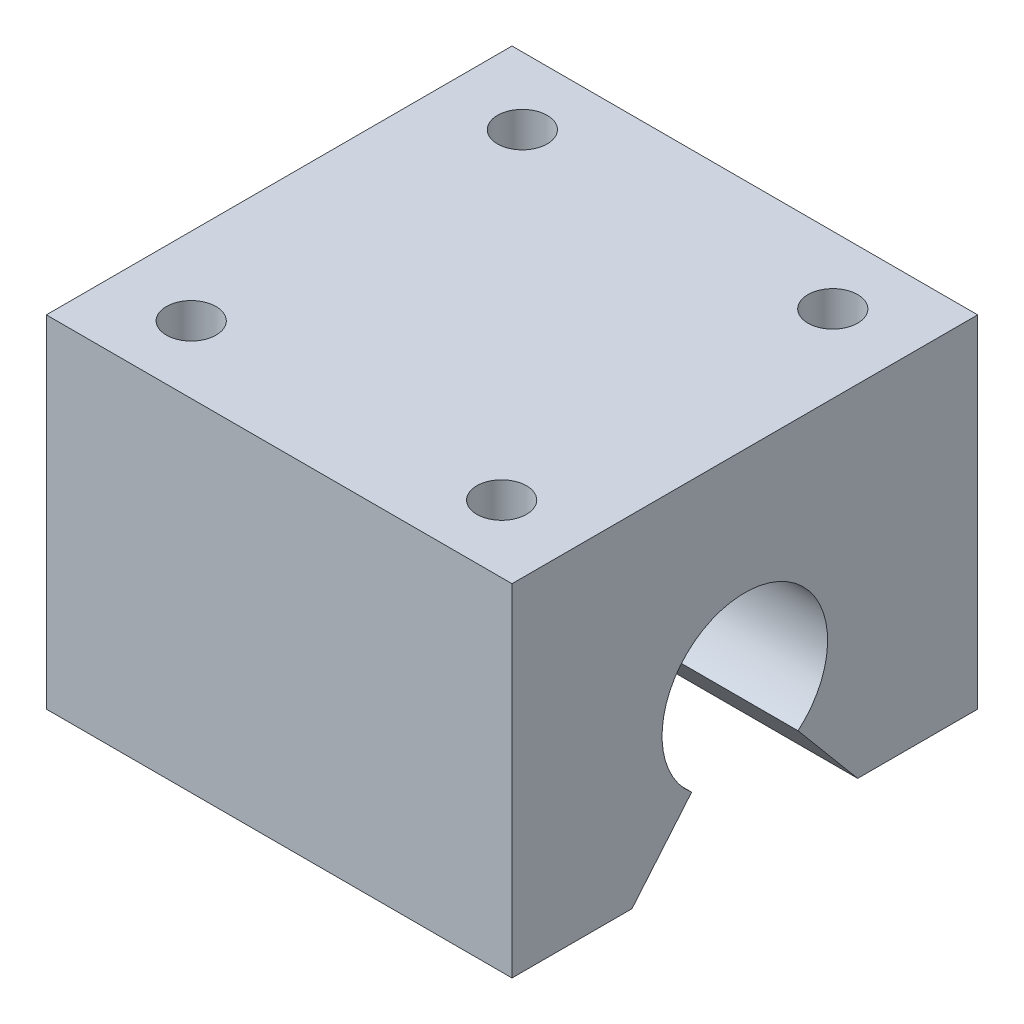
ISO-10303-21;
HEADER;
FILE_DESCRIPTION(('STEP AP214'),'2;1');
FILE_NAME('part.step','',(''),(''),'','','');
FILE_SCHEMA(('AUTOMOTIVE_DESIGN { 1 0 10303 214 1 1 1 1 }'));
ENDSEC;
DATA;
#1=APPLICATION_CONTEXT('core data for automotive mechanical design processes');
#2=APPLICATION_PROTOCOL_DEFINITION('international standard','automotive_design',2000,#1);
#3=PRODUCT_CONTEXT('',#1,'mechanical');
#4=PRODUCT('Part','Part','',(#3));
#5=PRODUCT_RELATED_PRODUCT_CATEGORY('part','',(#4));
#6=PRODUCT_DEFINITION_FORMATION('','',#4);
#7=PRODUCT_DEFINITION_CONTEXT('part definition',#1,'design');
#8=PRODUCT_DEFINITION('design','',#6,#7);
#9=PRODUCT_DEFINITION_SHAPE('','',#8);
#10=(LENGTH_UNIT() NAMED_UNIT(*) SI_UNIT(.MILLI.,.METRE.));
#11=(NAMED_UNIT(*) PLANE_ANGLE_UNIT() SI_UNIT($,.RADIAN.));
#12=(NAMED_UNIT(*) SI_UNIT($,.STERADIAN.) SOLID_ANGLE_UNIT());
#13=UNCERTAINTY_MEASURE_WITH_UNIT(LENGTH_MEASURE(1.E-05),#10,'distance_accuracy_value','');
#14=(GEOMETRIC_REPRESENTATION_CONTEXT(3) GLOBAL_UNCERTAINTY_ASSIGNED_CONTEXT((#13)) GLOBAL_UNIT_ASSIGNED_CONTEXT((#10,
#11,#12)) REPRESENTATION_CONTEXT('',''));
#15=CARTESIAN_POINT('',(0.,0.,0.));
#16=DIRECTION('',(0.,0.,1.));
#17=DIRECTION('',(1.,0.,0.));
#18=AXIS2_PLACEMENT_3D('',#15,#16,#17);
#19=CARTESIAN_POINT('',(45.,0.,0.));
#20=DIRECTION('',(-1.,0.,0.));
#21=DIRECTION('',(0.,0.,1.));
#22=AXIS2_PLACEMENT_3D('',#19,#20,#21);
#23=CYLINDRICAL_SURFACE('',#22,8.);
#24=CARTESIAN_POINT('',(0.,0.,0.));
#25=DIRECTION('',(-1.,0.,0.));
#26=DIRECTION('',(0.,0.,-1.));
#27=AXIS2_PLACEMENT_3D('',#24,#25,#26);
#28=CIRCLE('',#27,8.);
#29=CARTESIAN_POINT('',(0.,-6.12835554495185,5.14230087749228));
#30=VERTEX_POINT('',#29);
#31=CARTESIAN_POINT('',(0.,-6.12835554495185,-5.14230087749228));
#32=VERTEX_POINT('',#31);
#33=EDGE_CURVE('E130',#30,#32,#28,.T.);
#34=ORIENTED_EDGE('',*,*,#33,.T.);
#35=DIRECTION('',(-1.,0.,0.));
#36=VECTOR('',#35,1.);
#37=CARTESIAN_POINT('',(45.,-6.12835554495185,-5.14230087749228));
#38=LINE('',#37,#36);
#39=CARTESIAN_POINT('',(45.,-6.12835554495185,-5.14230087749228));
#40=VERTEX_POINT('',#39);
#41=EDGE_CURVE('E11',#40,#32,#38,.T.);
#42=ORIENTED_EDGE('',*,*,#41,.F.);
#43=CARTESIAN_POINT('',(45.,0.,0.));
#44=DIRECTION('',(-1.,0.,0.));
#45=DIRECTION('',(0.,0.,-1.));
#46=AXIS2_PLACEMENT_3D('',#43,#44,#45);
#47=CIRCLE('',#46,8.);
#48=CARTESIAN_POINT('',(45.,-6.12835554495185,5.14230087749228));
#49=VERTEX_POINT('',#48);
#50=EDGE_CURVE('E145',#49,#40,#47,.T.);
#51=ORIENTED_EDGE('',*,*,#50,.F.);
#52=DIRECTION('',(-1.,0.,0.));
#53=VECTOR('',#52,1.);
#54=CARTESIAN_POINT('',(45.,-6.12835554495185,5.14230087749228));
#55=LINE('',#54,#53);
#56=EDGE_CURVE('E126',#49,#30,#55,.T.);
#57=ORIENTED_EDGE('',*,*,#56,.T.);
#58=EDGE_LOOP('',(#34,#42,#51,#57));
#59=FACE_BOUND('',#58,.T.);
#60=ADVANCED_FACE('F34',(#59),#23,.F.);
#61=CARTESIAN_POINT('',(45.,-6.12835554495185,-5.14230087749228));
#62=DIRECTION('',(0.,0.642787609686535,-0.766044443118982));
#63=DIRECTION('',(0.,0.766044443118982,0.642787609686535));
#64=AXIS2_PLACEMENT_3D('',#61,#62,#63);
#65=PLANE('',#64);
#66=DIRECTION('',(0.,-0.766044443118982,-0.642787609686535));
#67=VECTOR('',#66,1.);
#68=CARTESIAN_POINT('',(0.,-6.12835554495185,-5.14230087749228));
#69=LINE('',#68,#67);
#70=CARTESIAN_POINT('',(0.,-13.,-10.9082952053045));
#71=VERTEX_POINT('',#70);
#72=EDGE_CURVE('E133',#32,#71,#69,.T.);
#73=ORIENTED_EDGE('',*,*,#72,.T.);
#74=DIRECTION('',(-1.,0.,0.));
#75=VECTOR('',#74,1.);
#76=CARTESIAN_POINT('',(45.,-13.,-10.9082952053045));
#77=LINE('',#76,#75);
#78=CARTESIAN_POINT('',(45.,-13.,-10.9082952053045));
#79=VERTEX_POINT('',#78);
#80=EDGE_CURVE('E42',#79,#71,#77,.T.);
#81=ORIENTED_EDGE('',*,*,#80,.F.);
#82=DIRECTION('',(0.,-0.766044443118982,-0.642787609686535));
#83=VECTOR('',#82,1.);
#84=CARTESIAN_POINT('',(45.,-6.12835554495185,-5.14230087749228));
#85=LINE('',#84,#83);
#86=EDGE_CURVE('E93',#40,#79,#85,.T.);
#87=ORIENTED_EDGE('',*,*,#86,.F.);
#88=ORIENTED_EDGE('',*,*,#41,.T.);
#89=EDGE_LOOP('',(#73,#81,#87,#88));
#90=FACE_BOUND('',#89,.T.);
#91=ADVANCED_FACE('F236',(#90),#65,.F.);
#92=CARTESIAN_POINT('',(45.,-13.,-10.9082952053045));
#93=DIRECTION('',(0.,1.,0.));
#94=DIRECTION('',(0.,0.,1.));
#95=AXIS2_PLACEMENT_3D('',#92,#93,#94);
#96=PLANE('',#95);
#97=DIRECTION('',(0.,0.,-1.));
#98=VECTOR('',#97,1.);
#99=CARTESIAN_POINT('',(0.,-13.,-10.9082952053045));
#100=LINE('',#99,#98);
#101=CARTESIAN_POINT('',(0.,-13.,-22.5));
#102=VERTEX_POINT('',#101);
#103=EDGE_CURVE('E136',#71,#102,#100,.T.);
#104=ORIENTED_EDGE('',*,*,#103,.T.);
#105=DIRECTION('',(-1.,0.,0.));
#106=VECTOR('',#105,1.);
#107=CARTESIAN_POINT('',(45.,-13.,-22.5));
#108=LINE('',#107,#106);
#109=CARTESIAN_POINT('',(45.,-13.,-22.5));
#110=VERTEX_POINT('',#109);
#111=EDGE_CURVE('E152',#110,#102,#108,.T.);
#112=ORIENTED_EDGE('',*,*,#111,.F.);
#113=DIRECTION('',(0.,0.,-1.));
#114=VECTOR('',#113,1.);
#115=CARTESIAN_POINT('',(45.,-13.,-10.9082952053045));
#116=LINE('',#115,#114);
#117=EDGE_CURVE('E160',#79,#110,#116,.T.);
#118=ORIENTED_EDGE('',*,*,#117,.F.);
#119=ORIENTED_EDGE('',*,*,#80,.T.);
#120=EDGE_LOOP('',(#104,#112,#118,#119));
#121=FACE_BOUND('',#120,.T.);
#122=ADVANCED_FACE('F158',(#121),#96,.F.);
#123=CARTESIAN_POINT('',(45.,20.,-22.5));
#124=DIRECTION('',(0.,0.,1.));
#125=DIRECTION('',(0.,-1.,0.));
#126=AXIS2_PLACEMENT_3D('',#123,#124,#125);
#127=PLANE('',#126);
#128=DIRECTION('',(0.,1.,0.));
#129=VECTOR('',#128,1.);
#130=CARTESIAN_POINT('',(0.,20.,-22.5));
#131=LINE('',#130,#129);
#132=CARTESIAN_POINT('',(0.,20.,-22.5));
#133=VERTEX_POINT('',#132);
#134=EDGE_CURVE('E138',#102,#133,#131,.T.);
#135=ORIENTED_EDGE('',*,*,#134,.T.);
#136=DIRECTION('',(-1.,0.,0.));
#137=VECTOR('',#136,1.);
#138=CARTESIAN_POINT('',(45.,20.,-22.5));
#139=LINE('',#138,#137);
#140=CARTESIAN_POINT('',(45.,20.,-22.5));
#141=VERTEX_POINT('',#140);
#142=EDGE_CURVE('E149',#141,#133,#139,.T.);
#143=ORIENTED_EDGE('',*,*,#142,.F.);
#144=DIRECTION('',(0.,1.,0.));
#145=VECTOR('',#144,1.);
#146=CARTESIAN_POINT('',(45.,20.,-22.5));
#147=LINE('',#146,#145);
#148=EDGE_CURVE('E172',#110,#141,#147,.T.);
#149=ORIENTED_EDGE('',*,*,#148,.F.);
#150=ORIENTED_EDGE('',*,*,#111,.T.);
#151=EDGE_LOOP('',(#135,#143,#149,#150));
#152=FACE_BOUND('',#151,.T.);
#153=ADVANCED_FACE('F168',(#152),#127,.F.);
#154=CARTESIAN_POINT('',(45.,20.,22.5));
#155=DIRECTION('',(0.,-1.,0.));
#156=DIRECTION('',(0.,0.,-1.));
#157=AXIS2_PLACEMENT_3D('',#154,#155,#156);
#158=PLANE('',#157);
#159=CARTESIAN_POINT('',(7.5,20.,16.));
#160=DIRECTION('',(0.,1.,0.));
#161=DIRECTION('',(0.,0.,1.));
#162=AXIS2_PLACEMENT_3D('',#159,#160,#161);
#163=CIRCLE('',#162,2.4);
#164=CARTESIAN_POINT('',(7.5,20.,18.4));
#165=VERTEX_POINT('',#164);
#166=EDGE_CURVE('E196',#165,#165,#163,.T.);
#167=ORIENTED_EDGE('',*,*,#166,.F.);
#168=EDGE_LOOP('',(#167));
#169=FACE_BOUND('',#168,.T.);
#170=CARTESIAN_POINT('',(37.5,20.,16.));
#171=DIRECTION('',(0.,1.,0.));
#172=DIRECTION('',(0.,0.,1.));
#173=AXIS2_PLACEMENT_3D('',#170,#171,#172);
#174=CIRCLE('',#173,2.4);
#175=CARTESIAN_POINT('',(37.5,20.,18.4));
#176=VERTEX_POINT('',#175);
#177=EDGE_CURVE('E190',#176,#176,#174,.T.);
#178=ORIENTED_EDGE('',*,*,#177,.F.);
#179=EDGE_LOOP('',(#178));
#180=FACE_BOUND('',#179,.T.);
#181=CARTESIAN_POINT('',(37.5,20.,-16.));
#182=DIRECTION('',(0.,1.,0.));
#183=DIRECTION('',(0.,0.,1.));
#184=AXIS2_PLACEMENT_3D('',#181,#182,#183);
#185=CIRCLE('',#184,2.4);
#186=CARTESIAN_POINT('',(37.5,20.,-13.6));
#187=VERTEX_POINT('',#186);
#188=EDGE_CURVE('E184',#187,#187,#185,.T.);
#189=ORIENTED_EDGE('',*,*,#188,.F.);
#190=EDGE_LOOP('',(#189));
#191=FACE_BOUND('',#190,.T.);
#192=CARTESIAN_POINT('',(7.5,20.,-16.));
#193=DIRECTION('',(0.,1.,0.));
#194=DIRECTION('',(0.,0.,1.));
#195=AXIS2_PLACEMENT_3D('',#192,#193,#194);
#196=CIRCLE('',#195,2.4);
#197=CARTESIAN_POINT('',(7.5,20.,-13.6));
#198=VERTEX_POINT('',#197);
#199=EDGE_CURVE('E178',#198,#198,#196,.T.);
#200=ORIENTED_EDGE('',*,*,#199,.F.);
#201=EDGE_LOOP('',(#200));
#202=FACE_BOUND('',#201,.T.);
#203=DIRECTION('',(0.,0.,1.));
#204=VECTOR('',#203,1.);
#205=CARTESIAN_POINT('',(0.,20.,22.5));
#206=LINE('',#205,#204);
#207=CARTESIAN_POINT('',(0.,20.,22.5));
#208=VERTEX_POINT('',#207);
#209=EDGE_CURVE('E140',#133,#208,#206,.T.);
#210=ORIENTED_EDGE('',*,*,#209,.T.);
#211=DIRECTION('',(-1.,0.,0.));
#212=VECTOR('',#211,1.);
#213=CARTESIAN_POINT('',(45.,20.,22.5));
#214=LINE('',#213,#212);
#215=CARTESIAN_POINT('',(45.,20.,22.5));
#216=VERTEX_POINT('',#215);
#217=EDGE_CURVE('E121',#216,#208,#214,.T.);
#218=ORIENTED_EDGE('',*,*,#217,.F.);
#219=DIRECTION('',(0.,0.,1.));
#220=VECTOR('',#219,1.);
#221=CARTESIAN_POINT('',(45.,20.,22.5));
#222=LINE('',#221,#220);
#223=EDGE_CURVE('E112',#141,#216,#222,.T.);
#224=ORIENTED_EDGE('',*,*,#223,.F.);
#225=ORIENTED_EDGE('',*,*,#142,.T.);
#226=EDGE_LOOP('',(#210,#218,#224,#225));
#227=FACE_BOUND('',#226,.T.);
#228=ADVANCED_FACE('F171',(#169,#180,#191,#202,#227),#158,.F.);
#229=CARTESIAN_POINT('',(45.,20.,22.5));
#230=DIRECTION('',(0.,0.,-1.));
#231=DIRECTION('',(0.,1.,0.));
#232=AXIS2_PLACEMENT_3D('',#229,#230,#231);
#233=PLANE('',#232);
#234=DIRECTION('',(0.,-1.,0.));
#235=VECTOR('',#234,1.);
#236=CARTESIAN_POINT('',(0.,20.,22.5));
#237=LINE('',#236,#235);
#238=CARTESIAN_POINT('',(0.,-13.,22.5));
#239=VERTEX_POINT('',#238);
#240=EDGE_CURVE('E120',#208,#239,#237,.T.);
#241=ORIENTED_EDGE('',*,*,#240,.T.);
#242=DIRECTION('',(-1.,0.,0.));
#243=VECTOR('',#242,1.);
#244=CARTESIAN_POINT('',(45.,-13.,22.5));
#245=LINE('',#244,#243);
#246=CARTESIAN_POINT('',(45.,-13.,22.5));
#247=VERTEX_POINT('',#246);
#248=EDGE_CURVE('E117',#247,#239,#245,.T.);
#249=ORIENTED_EDGE('',*,*,#248,.F.);
#250=DIRECTION('',(0.,-1.,0.));
#251=VECTOR('',#250,1.);
#252=CARTESIAN_POINT('',(45.,20.,22.5));
#253=LINE('',#252,#251);
#254=EDGE_CURVE('E106',#216,#247,#253,.T.);
#255=ORIENTED_EDGE('',*,*,#254,.F.);
#256=ORIENTED_EDGE('',*,*,#217,.T.);
#257=EDGE_LOOP('',(#241,#249,#255,#256));
#258=FACE_BOUND('',#257,.T.);
#259=ADVANCED_FACE('F118',(#258),#233,.F.);
#260=CARTESIAN_POINT('',(45.,-13.,22.5));
#261=DIRECTION('',(0.,1.,0.));
#262=DIRECTION('',(0.,0.,1.));
#263=AXIS2_PLACEMENT_3D('',#260,#261,#262);
#264=PLANE('',#263);
#265=DIRECTION('',(0.,0.,-1.));
#266=VECTOR('',#265,1.);
#267=CARTESIAN_POINT('',(0.,-13.,22.5));
#268=LINE('',#267,#266);
#269=CARTESIAN_POINT('',(0.,-13.,10.9082952053045));
#270=VERTEX_POINT('',#269);
#271=EDGE_CURVE('E79',#239,#270,#268,.T.);
#272=ORIENTED_EDGE('',*,*,#271,.T.);
#273=DIRECTION('',(-1.,0.,0.));
#274=VECTOR('',#273,1.);
#275=CARTESIAN_POINT('',(45.,-13.,10.9082952053045));
#276=LINE('',#275,#274);
#277=CARTESIAN_POINT('',(45.,-13.,10.9082952053045));
#278=VERTEX_POINT('',#277);
#279=EDGE_CURVE('E122',#278,#270,#276,.T.);
#280=ORIENTED_EDGE('',*,*,#279,.F.);
#281=DIRECTION('',(0.,0.,-1.));
#282=VECTOR('',#281,1.);
#283=CARTESIAN_POINT('',(45.,-13.,22.5));
#284=LINE('',#283,#282);
#285=EDGE_CURVE('E110',#247,#278,#284,.T.);
#286=ORIENTED_EDGE('',*,*,#285,.F.);
#287=ORIENTED_EDGE('',*,*,#248,.T.);
#288=EDGE_LOOP('',(#272,#280,#286,#287));
#289=FACE_BOUND('',#288,.T.);
#290=ADVANCED_FACE('F124',(#289),#264,.F.);
#291=CARTESIAN_POINT('',(45.,-6.12835554495185,5.14230087749228));
#292=DIRECTION('',(0.,0.642787609686535,0.766044443118982));
#293=DIRECTION('',(0.,-0.766044443118982,0.642787609686535));
#294=AXIS2_PLACEMENT_3D('',#291,#292,#293);
#295=PLANE('',#294);
#296=DIRECTION('',(0.,0.766044443118982,-0.642787609686535));
#297=VECTOR('',#296,1.);
#298=CARTESIAN_POINT('',(0.,-6.12835554495185,5.14230087749228));
#299=LINE('',#298,#297);
#300=EDGE_CURVE('E85',#270,#30,#299,.T.);
#301=ORIENTED_EDGE('',*,*,#300,.T.);
#302=ORIENTED_EDGE('',*,*,#56,.F.);
#303=DIRECTION('',(0.,0.766044443118982,-0.642787609686535));
#304=VECTOR('',#303,1.);
#305=CARTESIAN_POINT('',(45.,-6.12835554495185,5.14230087749228));
#306=LINE('',#305,#304);
#307=EDGE_CURVE('E50',#278,#49,#306,.T.);
#308=ORIENTED_EDGE('',*,*,#307,.F.);
#309=ORIENTED_EDGE('',*,*,#279,.T.);
#310=EDGE_LOOP('',(#301,#302,#308,#309));
#311=FACE_BOUND('',#310,.T.);
#312=ADVANCED_FACE('F243',(#311),#295,.F.);
#313=CARTESIAN_POINT('',(45.,0.,0.));
#314=DIRECTION('',(1.,0.,0.));
#315=DIRECTION('',(0.,0.,-1.));
#316=AXIS2_PLACEMENT_3D('',#313,#314,#315);
#317=PLANE('',#316);
#318=ORIENTED_EDGE('',*,*,#50,.T.);
#319=ORIENTED_EDGE('',*,*,#86,.T.);
#320=ORIENTED_EDGE('',*,*,#117,.T.);
#321=ORIENTED_EDGE('',*,*,#148,.T.);
#322=ORIENTED_EDGE('',*,*,#223,.T.);
#323=ORIENTED_EDGE('',*,*,#254,.T.);
#324=ORIENTED_EDGE('',*,*,#285,.T.);
#325=ORIENTED_EDGE('',*,*,#307,.T.);
#326=EDGE_LOOP('',(#318,#319,#320,#321,#322,#323,#324,#325));
#327=FACE_BOUND('',#326,.T.);
#328=ADVANCED_FACE('F108',(#327),#317,.T.);
#329=CARTESIAN_POINT('',(0.,0.,0.));
#330=DIRECTION('',(1.,0.,0.));
#331=DIRECTION('',(0.,0.,-1.));
#332=AXIS2_PLACEMENT_3D('',#329,#330,#331);
#333=PLANE('',#332);
#334=ORIENTED_EDGE('',*,*,#33,.F.);
#335=ORIENTED_EDGE('',*,*,#300,.F.);
#336=ORIENTED_EDGE('',*,*,#271,.F.);
#337=ORIENTED_EDGE('',*,*,#240,.F.);
#338=ORIENTED_EDGE('',*,*,#209,.F.);
#339=ORIENTED_EDGE('',*,*,#134,.F.);
#340=ORIENTED_EDGE('',*,*,#103,.F.);
#341=ORIENTED_EDGE('',*,*,#72,.F.);
#342=EDGE_LOOP('',(#334,#335,#336,#337,#338,#339,#340,#341));
#343=FACE_BOUND('',#342,.T.);
#344=ADVANCED_FACE('F164',(#343),#333,.F.);
#345=CARTESIAN_POINT('',(7.5,11.,-16.));
#346=DIRECTION('',(0.,1.,0.));
#347=DIRECTION('',(0.,0.,1.));
#348=AXIS2_PLACEMENT_3D('',#345,#346,#347);
#349=CYLINDRICAL_SURFACE('',#348,2.4);
#350=CARTESIAN_POINT('',(7.5,11.,-16.));
#351=DIRECTION('',(0.,1.,0.));
#352=DIRECTION('',(0.,0.,1.));
#353=AXIS2_PLACEMENT_3D('',#350,#351,#352);
#354=CIRCLE('',#353,2.4);
#355=CARTESIAN_POINT('',(7.5,11.,-13.6));
#356=VERTEX_POINT('',#355);
#357=EDGE_CURVE('E134',#356,#356,#354,.T.);
#358=ORIENTED_EDGE('',*,*,#357,.F.);
#359=EDGE_LOOP('',(#358));
#360=FACE_BOUND('',#359,.T.);
#361=ORIENTED_EDGE('',*,*,#199,.T.);
#362=EDGE_LOOP('',(#361));
#363=FACE_BOUND('',#362,.T.);
#364=ADVANCED_FACE('F220',(#360,#363),#349,.F.);
#365=CARTESIAN_POINT('',(7.5,11.,-16.));
#366=DIRECTION('',(0.,1.,0.));
#367=DIRECTION('',(0.,0.,1.));
#368=AXIS2_PLACEMENT_3D('',#365,#366,#367);
#369=PLANE('',#368);
#370=ORIENTED_EDGE('',*,*,#357,.T.);
#371=EDGE_LOOP('',(#370));
#372=FACE_BOUND('',#371,.T.);
#373=ADVANCED_FACE('F222',(#372),#369,.T.);
#374=CARTESIAN_POINT('',(37.5,11.,-16.));
#375=DIRECTION('',(0.,1.,0.));
#376=DIRECTION('',(0.,0.,1.));
#377=AXIS2_PLACEMENT_3D('',#374,#375,#376);
#378=CYLINDRICAL_SURFACE('',#377,2.4);
#379=CARTESIAN_POINT('',(37.5,11.,-16.));
#380=DIRECTION('',(0.,1.,0.));
#381=DIRECTION('',(0.,0.,1.));
#382=AXIS2_PLACEMENT_3D('',#379,#380,#381);
#383=CIRCLE('',#382,2.4);
#384=CARTESIAN_POINT('',(37.5,11.,-13.6));
#385=VERTEX_POINT('',#384);
#386=EDGE_CURVE('E181',#385,#385,#383,.T.);
#387=ORIENTED_EDGE('',*,*,#386,.F.);
#388=EDGE_LOOP('',(#387));
#389=FACE_BOUND('',#388,.T.);
#390=ORIENTED_EDGE('',*,*,#188,.T.);
#391=EDGE_LOOP('',(#390));
#392=FACE_BOUND('',#391,.T.);
#393=ADVANCED_FACE('F229',(#389,#392),#378,.F.);
#394=CARTESIAN_POINT('',(37.5,11.,-16.));
#395=DIRECTION('',(0.,1.,0.));
#396=DIRECTION('',(0.,0.,1.));
#397=AXIS2_PLACEMENT_3D('',#394,#395,#396);
#398=PLANE('',#397);
#399=ORIENTED_EDGE('',*,*,#386,.T.);
#400=EDGE_LOOP('',(#399));
#401=FACE_BOUND('',#400,.T.);
#402=ADVANCED_FACE('F312',(#401),#398,.T.);
#403=CARTESIAN_POINT('',(37.5,11.,16.));
#404=DIRECTION('',(0.,1.,0.));
#405=DIRECTION('',(0.,0.,1.));
#406=AXIS2_PLACEMENT_3D('',#403,#404,#405);
#407=CYLINDRICAL_SURFACE('',#406,2.4);
#408=CARTESIAN_POINT('',(37.5,11.,16.));
#409=DIRECTION('',(0.,1.,0.));
#410=DIRECTION('',(0.,0.,1.));
#411=AXIS2_PLACEMENT_3D('',#408,#409,#410);
#412=CIRCLE('',#411,2.4);
#413=CARTESIAN_POINT('',(37.5,11.,18.4));
#414=VERTEX_POINT('',#413);
#415=EDGE_CURVE('E187',#414,#414,#412,.T.);
#416=ORIENTED_EDGE('',*,*,#415,.F.);
#417=EDGE_LOOP('',(#416));
#418=FACE_BOUND('',#417,.T.);
#419=ORIENTED_EDGE('',*,*,#177,.T.);
#420=EDGE_LOOP('',(#419));
#421=FACE_BOUND('',#420,.T.);
#422=ADVANCED_FACE('F321',(#418,#421),#407,.F.);
#423=CARTESIAN_POINT('',(37.5,11.,16.));
#424=DIRECTION('',(0.,1.,0.));
#425=DIRECTION('',(0.,0.,1.));
#426=AXIS2_PLACEMENT_3D('',#423,#424,#425);
#427=PLANE('',#426);
#428=ORIENTED_EDGE('',*,*,#415,.T.);
#429=EDGE_LOOP('',(#428));
#430=FACE_BOUND('',#429,.T.);
#431=ADVANCED_FACE('F207',(#430),#427,.T.);
#432=CARTESIAN_POINT('',(7.5,11.,16.));
#433=DIRECTION('',(0.,1.,0.));
#434=DIRECTION('',(0.,0.,1.));
#435=AXIS2_PLACEMENT_3D('',#432,#433,#434);
#436=CYLINDRICAL_SURFACE('',#435,2.4);
#437=CARTESIAN_POINT('',(7.5,11.,16.));
#438=DIRECTION('',(0.,1.,0.));
#439=DIRECTION('',(0.,0.,1.));
#440=AXIS2_PLACEMENT_3D('',#437,#438,#439);
#441=CIRCLE('',#440,2.4);
#442=CARTESIAN_POINT('',(7.5,11.,18.4));
#443=VERTEX_POINT('',#442);
#444=EDGE_CURVE('E193',#443,#443,#441,.T.);
#445=ORIENTED_EDGE('',*,*,#444,.F.);
#446=EDGE_LOOP('',(#445));
#447=FACE_BOUND('',#446,.T.);
#448=ORIENTED_EDGE('',*,*,#166,.T.);
#449=EDGE_LOOP('',(#448));
#450=FACE_BOUND('',#449,.T.);
#451=ADVANCED_FACE('F204',(#447,#450),#436,.F.);
#452=CARTESIAN_POINT('',(7.5,11.,16.));
#453=DIRECTION('',(0.,1.,0.));
#454=DIRECTION('',(0.,0.,1.));
#455=AXIS2_PLACEMENT_3D('',#452,#453,#454);
#456=PLANE('',#455);
#457=ORIENTED_EDGE('',*,*,#444,.T.);
#458=EDGE_LOOP('',(#457));
#459=FACE_BOUND('',#458,.T.);
#460=ADVANCED_FACE('F202',(#459),#456,.T.);
#461=CLOSED_SHELL('',(#60,#91,#122,#153,#228,#259,#290,#312,#328,#344,#364,#373,#393,#402,#422,
#431,#451,#460));
#462=MANIFOLD_SOLID_BREP('B2',#461);
#463=ADVANCED_BREP_SHAPE_REPRESENTATION('',(#18,#462),#14);
#464=SHAPE_DEFINITION_REPRESENTATION(#9,#463);
ENDSEC;
END-ISO-10303-21;
